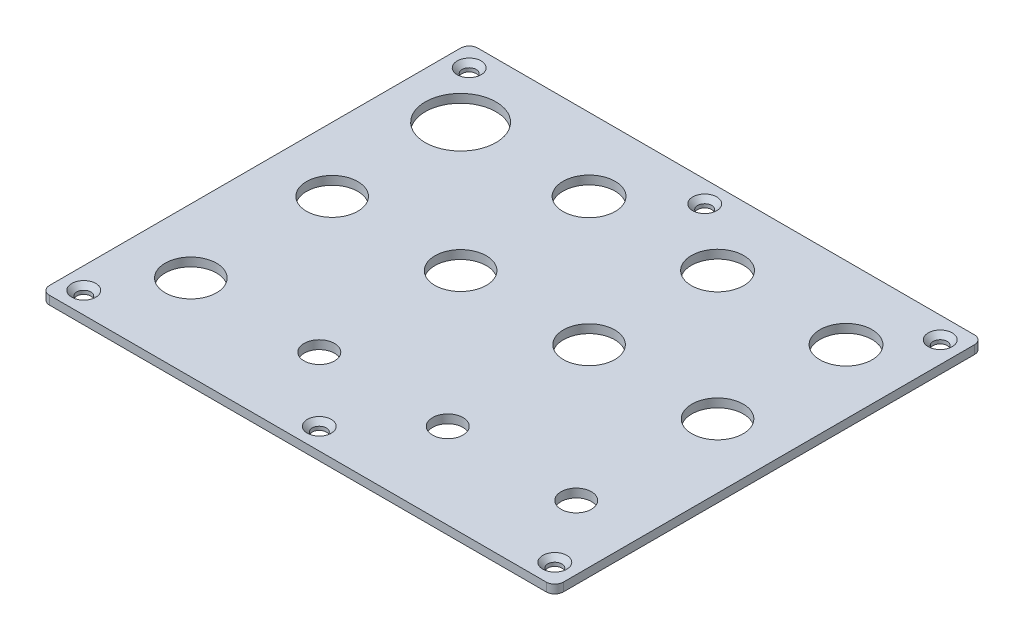
ISO-10303-21;
HEADER;
FILE_DESCRIPTION(('STEP AP214'),'2;1');
FILE_NAME('part.step','',(''),(''),'','','');
FILE_SCHEMA(('AUTOMOTIVE_DESIGN { 1 0 10303 214 1 1 1 1 }'));
ENDSEC;
DATA;
#1=APPLICATION_CONTEXT('core data for automotive mechanical design processes');
#2=APPLICATION_PROTOCOL_DEFINITION('international standard','automotive_design',2000,#1);
#3=PRODUCT_CONTEXT('',#1,'mechanical');
#4=PRODUCT('Part','Part','',(#3));
#5=PRODUCT_RELATED_PRODUCT_CATEGORY('part','',(#4));
#6=PRODUCT_DEFINITION_FORMATION('','',#4);
#7=PRODUCT_DEFINITION_CONTEXT('part definition',#1,'design');
#8=PRODUCT_DEFINITION('design','',#6,#7);
#9=PRODUCT_DEFINITION_SHAPE('','',#8);
#10=(LENGTH_UNIT() NAMED_UNIT(*) SI_UNIT(.MILLI.,.METRE.));
#11=(NAMED_UNIT(*) PLANE_ANGLE_UNIT() SI_UNIT($,.RADIAN.));
#12=(NAMED_UNIT(*) SI_UNIT($,.STERADIAN.) SOLID_ANGLE_UNIT());
#13=UNCERTAINTY_MEASURE_WITH_UNIT(LENGTH_MEASURE(1.E-05),#10,'distance_accuracy_value','');
#14=(GEOMETRIC_REPRESENTATION_CONTEXT(3) GLOBAL_UNCERTAINTY_ASSIGNED_CONTEXT((#13)) GLOBAL_UNIT_ASSIGNED_CONTEXT((#10,
#11,#12)) REPRESENTATION_CONTEXT('',''));
#15=CARTESIAN_POINT('',(0.,0.,0.));
#16=DIRECTION('',(0.,0.,1.));
#17=DIRECTION('',(1.,0.,0.));
#18=AXIS2_PLACEMENT_3D('',#15,#16,#17);
#19=CARTESIAN_POINT('',(-118.,2.,-1.99999999999999));
#20=DIRECTION('',(0.,-1.,0.));
#21=DIRECTION('',(0.,0.,-1.));
#22=AXIS2_PLACEMENT_3D('',#19,#20,#21);
#23=CYLINDRICAL_SURFACE('',#22,2.);
#24=DIRECTION('',(0.,-1.,0.));
#25=VECTOR('',#24,1.);
#26=CARTESIAN_POINT('',(-118.,2.,0.));
#27=LINE('',#26,#25);
#28=CARTESIAN_POINT('',(-118.,2.,0.));
#29=VERTEX_POINT('',#28);
#30=CARTESIAN_POINT('',(-118.,0.,0.));
#31=VERTEX_POINT('',#30);
#32=EDGE_CURVE('E173',#29,#31,#27,.T.);
#33=ORIENTED_EDGE('',*,*,#32,.F.);
#34=CARTESIAN_POINT('',(-118.,2.,-1.99999999999999));
#35=DIRECTION('',(0.,1.,0.));
#36=DIRECTION('',(0.,0.,1.));
#37=AXIS2_PLACEMENT_3D('',#34,#35,#36);
#38=CIRCLE('',#37,2.);
#39=CARTESIAN_POINT('',(-120.,2.,-1.99999999999999));
#40=VERTEX_POINT('',#39);
#41=EDGE_CURVE('E39',#40,#29,#38,.T.);
#42=ORIENTED_EDGE('',*,*,#41,.F.);
#43=DIRECTION('',(0.,-1.,0.));
#44=VECTOR('',#43,1.);
#45=CARTESIAN_POINT('',(-120.,2.,-1.99999999999999));
#46=LINE('',#45,#44);
#47=CARTESIAN_POINT('',(-120.,0.,-1.99999999999999));
#48=VERTEX_POINT('',#47);
#49=EDGE_CURVE('E176',#48,#40,#46,.F.);
#50=ORIENTED_EDGE('',*,*,#49,.F.);
#51=CARTESIAN_POINT('',(-118.,0.,-1.99999999999999));
#52=DIRECTION('',(0.,1.,0.));
#53=DIRECTION('',(0.,0.,1.));
#54=AXIS2_PLACEMENT_3D('',#51,#52,#53);
#55=CIRCLE('',#54,2.);
#56=EDGE_CURVE('E11',#31,#48,#55,.F.);
#57=ORIENTED_EDGE('',*,*,#56,.F.);
#58=EDGE_LOOP('',(#33,#42,#50,#57));
#59=FACE_BOUND('',#58,.T.);
#60=ADVANCED_FACE('F32',(#59),#23,.T.);
#61=CARTESIAN_POINT('',(-2.,2.,-2.));
#62=DIRECTION('',(0.,-1.,0.));
#63=DIRECTION('',(0.,0.,-1.));
#64=AXIS2_PLACEMENT_3D('',#61,#62,#63);
#65=CYLINDRICAL_SURFACE('',#64,2.);
#66=DIRECTION('',(0.,-1.,0.));
#67=VECTOR('',#66,1.);
#68=CARTESIAN_POINT('',(0.,2.,-2.));
#69=LINE('',#68,#67);
#70=CARTESIAN_POINT('',(0.,2.,-2.));
#71=VERTEX_POINT('',#70);
#72=CARTESIAN_POINT('',(0.,0.,-2.));
#73=VERTEX_POINT('',#72);
#74=EDGE_CURVE('E162',#71,#73,#69,.T.);
#75=ORIENTED_EDGE('',*,*,#74,.F.);
#76=CARTESIAN_POINT('',(-2.,2.,-2.));
#77=DIRECTION('',(0.,1.,0.));
#78=DIRECTION('',(0.,0.,1.));
#79=AXIS2_PLACEMENT_3D('',#76,#77,#78);
#80=CIRCLE('',#79,2.);
#81=CARTESIAN_POINT('',(-2.,2.,0.));
#82=VERTEX_POINT('',#81);
#83=EDGE_CURVE('E168',#82,#71,#80,.T.);
#84=ORIENTED_EDGE('',*,*,#83,.F.);
#85=DIRECTION('',(0.,-1.,0.));
#86=VECTOR('',#85,1.);
#87=CARTESIAN_POINT('',(-2.,2.,0.));
#88=LINE('',#87,#86);
#89=CARTESIAN_POINT('',(-2.,0.,0.));
#90=VERTEX_POINT('',#89);
#91=EDGE_CURVE('E165',#90,#82,#88,.F.);
#92=ORIENTED_EDGE('',*,*,#91,.F.);
#93=CARTESIAN_POINT('',(-2.,0.,-2.));
#94=DIRECTION('',(0.,1.,0.));
#95=DIRECTION('',(0.,0.,1.));
#96=AXIS2_PLACEMENT_3D('',#93,#94,#95);
#97=CIRCLE('',#96,2.);
#98=EDGE_CURVE('E170',#73,#90,#97,.F.);
#99=ORIENTED_EDGE('',*,*,#98,.F.);
#100=EDGE_LOOP('',(#75,#84,#92,#99));
#101=FACE_BOUND('',#100,.T.);
#102=ADVANCED_FACE('F215',(#101),#65,.T.);
#103=CARTESIAN_POINT('',(-2.,2.,-98.));
#104=DIRECTION('',(0.,-1.,0.));
#105=DIRECTION('',(0.,0.,-1.));
#106=AXIS2_PLACEMENT_3D('',#103,#104,#105);
#107=CYLINDRICAL_SURFACE('',#106,2.);
#108=DIRECTION('',(0.,-1.,0.));
#109=VECTOR('',#108,1.);
#110=CARTESIAN_POINT('',(-2.,2.,-100.));
#111=LINE('',#110,#109);
#112=CARTESIAN_POINT('',(-2.,2.,-100.));
#113=VERTEX_POINT('',#112);
#114=CARTESIAN_POINT('',(-2.,0.,-100.));
#115=VERTEX_POINT('',#114);
#116=EDGE_CURVE('E104',#113,#115,#111,.T.);
#117=ORIENTED_EDGE('',*,*,#116,.F.);
#118=CARTESIAN_POINT('',(-2.,2.,-98.));
#119=DIRECTION('',(0.,1.,0.));
#120=DIRECTION('',(0.,0.,1.));
#121=AXIS2_PLACEMENT_3D('',#118,#119,#120);
#122=CIRCLE('',#121,2.);
#123=CARTESIAN_POINT('',(0.,2.,-98.));
#124=VERTEX_POINT('',#123);
#125=EDGE_CURVE('E157',#124,#113,#122,.T.);
#126=ORIENTED_EDGE('',*,*,#125,.F.);
#127=DIRECTION('',(0.,-1.,0.));
#128=VECTOR('',#127,1.);
#129=CARTESIAN_POINT('',(0.,2.,-98.));
#130=LINE('',#129,#128);
#131=CARTESIAN_POINT('',(0.,0.,-98.));
#132=VERTEX_POINT('',#131);
#133=EDGE_CURVE('E154',#132,#124,#130,.F.);
#134=ORIENTED_EDGE('',*,*,#133,.F.);
#135=CARTESIAN_POINT('',(-2.,0.,-98.));
#136=DIRECTION('',(0.,1.,0.));
#137=DIRECTION('',(0.,0.,1.));
#138=AXIS2_PLACEMENT_3D('',#135,#136,#137);
#139=CIRCLE('',#138,2.);
#140=EDGE_CURVE('E159',#115,#132,#139,.F.);
#141=ORIENTED_EDGE('',*,*,#140,.F.);
#142=EDGE_LOOP('',(#117,#126,#134,#141));
#143=FACE_BOUND('',#142,.T.);
#144=ADVANCED_FACE('F210',(#143),#107,.T.);
#145=CARTESIAN_POINT('',(-118.,2.,-98.));
#146=DIRECTION('',(0.,-1.,0.));
#147=DIRECTION('',(0.,0.,-1.));
#148=AXIS2_PLACEMENT_3D('',#145,#146,#147);
#149=CYLINDRICAL_SURFACE('',#148,2.);
#150=DIRECTION('',(0.,-1.,0.));
#151=VECTOR('',#150,1.);
#152=CARTESIAN_POINT('',(-120.,2.,-98.));
#153=LINE('',#152,#151);
#154=CARTESIAN_POINT('',(-120.,2.,-98.));
#155=VERTEX_POINT('',#154);
#156=CARTESIAN_POINT('',(-120.,0.,-98.));
#157=VERTEX_POINT('',#156);
#158=EDGE_CURVE('E99',#155,#157,#153,.T.);
#159=ORIENTED_EDGE('',*,*,#158,.F.);
#160=CARTESIAN_POINT('',(-118.,2.,-98.));
#161=DIRECTION('',(0.,1.,0.));
#162=DIRECTION('',(0.,0.,1.));
#163=AXIS2_PLACEMENT_3D('',#160,#161,#162);
#164=CIRCLE('',#163,2.);
#165=CARTESIAN_POINT('',(-118.,2.,-100.));
#166=VERTEX_POINT('',#165);
#167=EDGE_CURVE('E105',#166,#155,#164,.T.);
#168=ORIENTED_EDGE('',*,*,#167,.F.);
#169=DIRECTION('',(0.,-1.,0.));
#170=VECTOR('',#169,1.);
#171=CARTESIAN_POINT('',(-118.,2.,-100.));
#172=LINE('',#171,#170);
#173=CARTESIAN_POINT('',(-118.,0.,-100.));
#174=VERTEX_POINT('',#173);
#175=EDGE_CURVE('E102',#174,#166,#172,.F.);
#176=ORIENTED_EDGE('',*,*,#175,.F.);
#177=CARTESIAN_POINT('',(-118.,0.,-98.));
#178=DIRECTION('',(0.,1.,0.));
#179=DIRECTION('',(0.,0.,1.));
#180=AXIS2_PLACEMENT_3D('',#177,#178,#179);
#181=CIRCLE('',#180,2.);
#182=EDGE_CURVE('E95',#157,#174,#181,.F.);
#183=ORIENTED_EDGE('',*,*,#182,.F.);
#184=EDGE_LOOP('',(#159,#168,#176,#183));
#185=FACE_BOUND('',#184,.T.);
#186=ADVANCED_FACE('F97',(#185),#149,.T.);
#187=CARTESIAN_POINT('',(0.,2.,0.));
#188=DIRECTION('',(-1.,0.,0.));
#189=DIRECTION('',(0.,0.,1.));
#190=AXIS2_PLACEMENT_3D('',#187,#188,#189);
#191=PLANE('',#190);
#192=DIRECTION('',(0.,0.,-1.));
#193=VECTOR('',#192,1.);
#194=CARTESIAN_POINT('',(0.,2.,0.));
#195=LINE('',#194,#193);
#196=EDGE_CURVE('E119',#71,#124,#195,.T.);
#197=ORIENTED_EDGE('',*,*,#196,.F.);
#198=ORIENTED_EDGE('',*,*,#74,.T.);
#199=DIRECTION('',(0.,0.,-1.));
#200=VECTOR('',#199,1.);
#201=CARTESIAN_POINT('',(0.,0.,0.));
#202=LINE('',#201,#200);
#203=EDGE_CURVE('E121',#73,#132,#202,.T.);
#204=ORIENTED_EDGE('',*,*,#203,.T.);
#205=ORIENTED_EDGE('',*,*,#133,.T.);
#206=EDGE_LOOP('',(#197,#198,#204,#205));
#207=FACE_BOUND('',#206,.T.);
#208=ADVANCED_FACE('F212',(#207),#191,.F.);
#209=CARTESIAN_POINT('',(0.,2.,-100.));
#210=DIRECTION('',(0.,0.,1.));
#211=DIRECTION('',(1.,0.,0.));
#212=AXIS2_PLACEMENT_3D('',#209,#210,#211);
#213=PLANE('',#212);
#214=DIRECTION('',(-1.,0.,0.));
#215=VECTOR('',#214,1.);
#216=CARTESIAN_POINT('',(0.,2.,-100.));
#217=LINE('',#216,#215);
#218=EDGE_CURVE('E185',#113,#166,#217,.T.);
#219=ORIENTED_EDGE('',*,*,#218,.F.);
#220=ORIENTED_EDGE('',*,*,#116,.T.);
#221=DIRECTION('',(-1.,0.,0.));
#222=VECTOR('',#221,1.);
#223=CARTESIAN_POINT('',(0.,0.,-100.));
#224=LINE('',#223,#222);
#225=EDGE_CURVE('E117',#115,#174,#224,.T.);
#226=ORIENTED_EDGE('',*,*,#225,.T.);
#227=ORIENTED_EDGE('',*,*,#175,.T.);
#228=EDGE_LOOP('',(#219,#220,#226,#227));
#229=FACE_BOUND('',#228,.T.);
#230=ADVANCED_FACE('F207',(#229),#213,.F.);
#231=CARTESIAN_POINT('',(-120.,2.,0.));
#232=DIRECTION('',(1.,0.,0.));
#233=DIRECTION('',(0.,0.,-1.));
#234=AXIS2_PLACEMENT_3D('',#231,#232,#233);
#235=PLANE('',#234);
#236=DIRECTION('',(0.,0.,1.));
#237=VECTOR('',#236,1.);
#238=CARTESIAN_POINT('',(-120.,0.,0.));
#239=LINE('',#238,#237);
#240=EDGE_CURVE('E110',#157,#48,#239,.T.);
#241=ORIENTED_EDGE('',*,*,#240,.T.);
#242=ORIENTED_EDGE('',*,*,#49,.T.);
#243=DIRECTION('',(0.,0.,1.));
#244=VECTOR('',#243,1.);
#245=CARTESIAN_POINT('',(-120.,2.,0.));
#246=LINE('',#245,#244);
#247=EDGE_CURVE('E112',#155,#40,#246,.T.);
#248=ORIENTED_EDGE('',*,*,#247,.F.);
#249=ORIENTED_EDGE('',*,*,#158,.T.);
#250=EDGE_LOOP('',(#241,#242,#248,#249));
#251=FACE_BOUND('',#250,.T.);
#252=ADVANCED_FACE('F109',(#251),#235,.F.);
#253=CARTESIAN_POINT('',(0.,2.,0.));
#254=DIRECTION('',(0.,0.,-1.));
#255=DIRECTION('',(-1.,0.,0.));
#256=AXIS2_PLACEMENT_3D('',#253,#254,#255);
#257=PLANE('',#256);
#258=DIRECTION('',(1.,0.,0.));
#259=VECTOR('',#258,1.);
#260=CARTESIAN_POINT('',(0.,2.,0.));
#261=LINE('',#260,#259);
#262=EDGE_CURVE('E113',#29,#82,#261,.T.);
#263=ORIENTED_EDGE('',*,*,#262,.F.);
#264=ORIENTED_EDGE('',*,*,#32,.T.);
#265=DIRECTION('',(1.,0.,0.));
#266=VECTOR('',#265,1.);
#267=CARTESIAN_POINT('',(0.,0.,0.));
#268=LINE('',#267,#266);
#269=EDGE_CURVE('E116',#31,#90,#268,.T.);
#270=ORIENTED_EDGE('',*,*,#269,.T.);
#271=ORIENTED_EDGE('',*,*,#91,.T.);
#272=EDGE_LOOP('',(#263,#264,#270,#271));
#273=FACE_BOUND('',#272,.T.);
#274=ADVANCED_FACE('F182',(#273),#257,.F.);
#275=CARTESIAN_POINT('',(0.,2.,0.));
#276=DIRECTION('',(0.,1.,0.));
#277=DIRECTION('',(0.,0.,1.));
#278=AXIS2_PLACEMENT_3D('',#275,#276,#277);
#279=PLANE('',#278);
#280=CARTESIAN_POINT('',(-60.,2.,-5.));
#281=DIRECTION('',(0.,1.,0.));
#282=DIRECTION('',(0.,0.,-1.));
#283=AXIS2_PLACEMENT_3D('',#280,#281,#282);
#284=CIRCLE('',#283,2.8);
#285=CARTESIAN_POINT('',(-60.,2.,-7.8));
#286=VERTEX_POINT('',#285);
#287=EDGE_CURVE('E148',#286,#286,#284,.T.);
#288=ORIENTED_EDGE('',*,*,#287,.F.);
#289=EDGE_LOOP('',(#288));
#290=FACE_BOUND('',#289,.T.);
#291=CARTESIAN_POINT('',(-60.,2.,-95.));
#292=DIRECTION('',(0.,1.,0.));
#293=DIRECTION('',(0.,0.,1.));
#294=AXIS2_PLACEMENT_3D('',#291,#292,#293);
#295=CIRCLE('',#294,2.8);
#296=CARTESIAN_POINT('',(-60.,2.,-92.2));
#297=VERTEX_POINT('',#296);
#298=EDGE_CURVE('E145',#297,#297,#295,.T.);
#299=ORIENTED_EDGE('',*,*,#298,.F.);
#300=EDGE_LOOP('',(#299));
#301=FACE_BOUND('',#300,.T.);
#302=CARTESIAN_POINT('',(-115.,2.,-4.99999999999999));
#303=DIRECTION('',(0.,1.,0.));
#304=DIRECTION('',(0.,0.,1.));
#305=AXIS2_PLACEMENT_3D('',#302,#303,#304);
#306=CIRCLE('',#305,2.79999999999999);
#307=CARTESIAN_POINT('',(-115.,2.,-2.2));
#308=VERTEX_POINT('',#307);
#309=EDGE_CURVE('E141',#308,#308,#306,.T.);
#310=ORIENTED_EDGE('',*,*,#309,.F.);
#311=EDGE_LOOP('',(#310));
#312=FACE_BOUND('',#311,.T.);
#313=CARTESIAN_POINT('',(-5.,2.,-4.99999999999999));
#314=DIRECTION('',(0.,1.,0.));
#315=DIRECTION('',(0.,0.,1.));
#316=AXIS2_PLACEMENT_3D('',#313,#314,#315);
#317=CIRCLE('',#316,2.8);
#318=CARTESIAN_POINT('',(-5.,2.,-2.19999999999999));
#319=VERTEX_POINT('',#318);
#320=EDGE_CURVE('E137',#319,#319,#317,.T.);
#321=ORIENTED_EDGE('',*,*,#320,.F.);
#322=EDGE_LOOP('',(#321));
#323=FACE_BOUND('',#322,.T.);
#324=CARTESIAN_POINT('',(-5.,2.,-95.));
#325=DIRECTION('',(0.,1.,0.));
#326=DIRECTION('',(0.,0.,1.));
#327=AXIS2_PLACEMENT_3D('',#324,#325,#326);
#328=CIRCLE('',#327,2.8);
#329=CARTESIAN_POINT('',(-5.,2.,-92.2));
#330=VERTEX_POINT('',#329);
#331=EDGE_CURVE('E133',#330,#330,#328,.T.);
#332=ORIENTED_EDGE('',*,*,#331,.F.);
#333=EDGE_LOOP('',(#332));
#334=FACE_BOUND('',#333,.T.);
#335=CARTESIAN_POINT('',(-115.,2.,-95.));
#336=DIRECTION('',(0.,1.,0.));
#337=DIRECTION('',(0.,0.,1.));
#338=AXIS2_PLACEMENT_3D('',#335,#336,#337);
#339=CIRCLE('',#338,2.79999999999999);
#340=CARTESIAN_POINT('',(-115.,2.,-92.2));
#341=VERTEX_POINT('',#340);
#342=EDGE_CURVE('E129',#341,#341,#339,.T.);
#343=ORIENTED_EDGE('',*,*,#342,.F.);
#344=EDGE_LOOP('',(#343));
#345=FACE_BOUND('',#344,.T.);
#346=CARTESIAN_POINT('',(-105.,2.,-20.));
#347=DIRECTION('',(0.,1.,0.));
#348=DIRECTION('',(0.,0.,1.));
#349=AXIS2_PLACEMENT_3D('',#346,#347,#348);
#350=CIRCLE('',#349,6.);
#351=CARTESIAN_POINT('',(-105.,2.,-14.));
#352=VERTEX_POINT('',#351);
#353=EDGE_CURVE('E362',#352,#352,#350,.T.);
#354=ORIENTED_EDGE('',*,*,#353,.F.);
#355=EDGE_LOOP('',(#354));
#356=FACE_BOUND('',#355,.T.);
#357=CARTESIAN_POINT('',(-15.,2.,-20.));
#358=DIRECTION('',(0.,1.,0.));
#359=DIRECTION('',(0.,0.,1.));
#360=AXIS2_PLACEMENT_3D('',#357,#358,#359);
#361=CIRCLE('',#360,3.55);
#362=CARTESIAN_POINT('',(-15.,2.,-16.45));
#363=VERTEX_POINT('',#362);
#364=EDGE_CURVE('E366',#363,#363,#361,.T.);
#365=ORIENTED_EDGE('',*,*,#364,.F.);
#366=EDGE_LOOP('',(#365));
#367=FACE_BOUND('',#366,.T.);
#368=CARTESIAN_POINT('',(-45.,2.,-20.));
#369=DIRECTION('',(0.,1.,0.));
#370=DIRECTION('',(0.,0.,1.));
#371=AXIS2_PLACEMENT_3D('',#368,#369,#370);
#372=CIRCLE('',#371,3.55);
#373=CARTESIAN_POINT('',(-45.,2.,-16.45));
#374=VERTEX_POINT('',#373);
#375=EDGE_CURVE('E372',#374,#374,#372,.T.);
#376=ORIENTED_EDGE('',*,*,#375,.F.);
#377=EDGE_LOOP('',(#376));
#378=FACE_BOUND('',#377,.T.);
#379=CARTESIAN_POINT('',(-75.,2.,-20.));
#380=DIRECTION('',(0.,1.,0.));
#381=DIRECTION('',(0.,0.,1.));
#382=AXIS2_PLACEMENT_3D('',#379,#380,#381);
#383=CIRCLE('',#382,3.55);
#384=CARTESIAN_POINT('',(-75.,2.,-16.45));
#385=VERTEX_POINT('',#384);
#386=EDGE_CURVE('E378',#385,#385,#383,.T.);
#387=ORIENTED_EDGE('',*,*,#386,.F.);
#388=EDGE_LOOP('',(#387));
#389=FACE_BOUND('',#388,.T.);
#390=CARTESIAN_POINT('',(-15.,2.,-83.));
#391=DIRECTION('',(0.,1.,0.));
#392=DIRECTION('',(0.,0.,1.));
#393=AXIS2_PLACEMENT_3D('',#390,#391,#392);
#394=CIRCLE('',#393,6.09999999999999);
#395=CARTESIAN_POINT('',(-15.,2.,-76.9));
#396=VERTEX_POINT('',#395);
#397=EDGE_CURVE('E384',#396,#396,#394,.T.);
#398=ORIENTED_EDGE('',*,*,#397,.F.);
#399=EDGE_LOOP('',(#398));
#400=FACE_BOUND('',#399,.T.);
#401=CARTESIAN_POINT('',(-45.,2.,-83.));
#402=DIRECTION('',(0.,1.,0.));
#403=DIRECTION('',(0.,0.,1.));
#404=AXIS2_PLACEMENT_3D('',#401,#402,#403);
#405=CIRCLE('',#404,6.1);
#406=CARTESIAN_POINT('',(-45.,2.,-76.9));
#407=VERTEX_POINT('',#406);
#408=EDGE_CURVE('E390',#407,#407,#405,.T.);
#409=ORIENTED_EDGE('',*,*,#408,.F.);
#410=EDGE_LOOP('',(#409));
#411=FACE_BOUND('',#410,.T.);
#412=CARTESIAN_POINT('',(-75.,2.,-83.));
#413=DIRECTION('',(0.,1.,0.));
#414=DIRECTION('',(0.,0.,1.));
#415=AXIS2_PLACEMENT_3D('',#412,#413,#414);
#416=CIRCLE('',#415,6.09999999999999);
#417=CARTESIAN_POINT('',(-75.,2.,-76.9));
#418=VERTEX_POINT('',#417);
#419=EDGE_CURVE('E396',#418,#418,#416,.T.);
#420=ORIENTED_EDGE('',*,*,#419,.F.);
#421=EDGE_LOOP('',(#420));
#422=FACE_BOUND('',#421,.T.);
#423=CARTESIAN_POINT('',(-105.,2.,-83.));
#424=DIRECTION('',(0.,1.,0.));
#425=DIRECTION('',(0.,0.,1.));
#426=AXIS2_PLACEMENT_3D('',#423,#424,#425);
#427=CIRCLE('',#426,8.25000000000001);
#428=CARTESIAN_POINT('',(-105.,2.,-74.75));
#429=VERTEX_POINT('',#428);
#430=EDGE_CURVE('E402',#429,#429,#427,.T.);
#431=ORIENTED_EDGE('',*,*,#430,.F.);
#432=EDGE_LOOP('',(#431));
#433=FACE_BOUND('',#432,.T.);
#434=CARTESIAN_POINT('',(-15.,2.,-53.));
#435=DIRECTION('',(0.,1.,0.));
#436=DIRECTION('',(0.,0.,1.));
#437=AXIS2_PLACEMENT_3D('',#434,#435,#436);
#438=CIRCLE('',#437,6.00000000000001);
#439=CARTESIAN_POINT('',(-15.,2.,-47.));
#440=VERTEX_POINT('',#439);
#441=EDGE_CURVE('E408',#440,#440,#438,.T.);
#442=ORIENTED_EDGE('',*,*,#441,.F.);
#443=EDGE_LOOP('',(#442));
#444=FACE_BOUND('',#443,.T.);
#445=CARTESIAN_POINT('',(-45.,2.,-53.));
#446=DIRECTION('',(0.,1.,0.));
#447=DIRECTION('',(0.,0.,1.));
#448=AXIS2_PLACEMENT_3D('',#445,#446,#447);
#449=CIRCLE('',#448,6.);
#450=CARTESIAN_POINT('',(-45.,2.,-47.));
#451=VERTEX_POINT('',#450);
#452=EDGE_CURVE('E414',#451,#451,#449,.T.);
#453=ORIENTED_EDGE('',*,*,#452,.F.);
#454=EDGE_LOOP('',(#453));
#455=FACE_BOUND('',#454,.T.);
#456=CARTESIAN_POINT('',(-75.,2.,-53.));
#457=DIRECTION('',(0.,1.,0.));
#458=DIRECTION('',(0.,0.,1.));
#459=AXIS2_PLACEMENT_3D('',#456,#457,#458);
#460=CIRCLE('',#459,6.);
#461=CARTESIAN_POINT('',(-75.,2.,-47.));
#462=VERTEX_POINT('',#461);
#463=EDGE_CURVE('E200',#462,#462,#460,.T.);
#464=ORIENTED_EDGE('',*,*,#463,.F.);
#465=EDGE_LOOP('',(#464));
#466=FACE_BOUND('',#465,.T.);
#467=CARTESIAN_POINT('',(-105.,2.,-53.));
#468=DIRECTION('',(0.,1.,0.));
#469=DIRECTION('',(0.,0.,1.));
#470=AXIS2_PLACEMENT_3D('',#467,#468,#469);
#471=CIRCLE('',#470,6.);
#472=CARTESIAN_POINT('',(-105.,2.,-47.));
#473=VERTEX_POINT('',#472);
#474=EDGE_CURVE('E192',#473,#473,#471,.T.);
#475=ORIENTED_EDGE('',*,*,#474,.F.);
#476=EDGE_LOOP('',(#475));
#477=FACE_BOUND('',#476,.T.);
#478=ORIENTED_EDGE('',*,*,#247,.T.);
#479=ORIENTED_EDGE('',*,*,#41,.T.);
#480=ORIENTED_EDGE('',*,*,#262,.T.);
#481=ORIENTED_EDGE('',*,*,#83,.T.);
#482=ORIENTED_EDGE('',*,*,#196,.T.);
#483=ORIENTED_EDGE('',*,*,#125,.T.);
#484=ORIENTED_EDGE('',*,*,#218,.T.);
#485=ORIENTED_EDGE('',*,*,#167,.T.);
#486=EDGE_LOOP('',(#478,#479,#480,#481,#482,#483,#484,#485));
#487=FACE_BOUND('',#486,.T.);
#488=ADVANCED_FACE('F178',(#290,#301,#312,#323,#334,#345,#356,#367,#378,#389,#400,#411,#422,
#433,#444,#455,#466,#477,#487),#279,.T.);
#489=CARTESIAN_POINT('',(0.,0.,0.));
#490=DIRECTION('',(0.,1.,0.));
#491=DIRECTION('',(0.,0.,1.));
#492=AXIS2_PLACEMENT_3D('',#489,#490,#491);
#493=PLANE('',#492);
#494=CARTESIAN_POINT('',(-60.,0.,-5.));
#495=DIRECTION('',(0.,1.,0.));
#496=DIRECTION('',(0.,0.,-1.));
#497=AXIS2_PLACEMENT_3D('',#494,#495,#496);
#498=CIRCLE('',#497,1.65);
#499=CARTESIAN_POINT('',(-60.,0.,-6.65000000000001));
#500=VERTEX_POINT('',#499);
#501=EDGE_CURVE('E128',#500,#500,#498,.T.);
#502=ORIENTED_EDGE('',*,*,#501,.T.);
#503=EDGE_LOOP('',(#502));
#504=FACE_BOUND('',#503,.T.);
#505=CARTESIAN_POINT('',(-60.,0.,-95.));
#506=DIRECTION('',(0.,1.,0.));
#507=DIRECTION('',(0.,0.,1.));
#508=AXIS2_PLACEMENT_3D('',#505,#506,#507);
#509=CIRCLE('',#508,1.65);
#510=CARTESIAN_POINT('',(-60.,0.,-93.35));
#511=VERTEX_POINT('',#510);
#512=EDGE_CURVE('E343',#511,#511,#509,.T.);
#513=ORIENTED_EDGE('',*,*,#512,.T.);
#514=EDGE_LOOP('',(#513));
#515=FACE_BOUND('',#514,.T.);
#516=CARTESIAN_POINT('',(-115.,0.,-4.99999999999999));
#517=DIRECTION('',(0.,1.,0.));
#518=DIRECTION('',(0.,0.,1.));
#519=AXIS2_PLACEMENT_3D('',#516,#517,#518);
#520=CIRCLE('',#519,1.65);
#521=CARTESIAN_POINT('',(-115.,0.,-3.34999999999999));
#522=VERTEX_POINT('',#521);
#523=EDGE_CURVE('E346',#522,#522,#520,.T.);
#524=ORIENTED_EDGE('',*,*,#523,.T.);
#525=EDGE_LOOP('',(#524));
#526=FACE_BOUND('',#525,.T.);
#527=CARTESIAN_POINT('',(-5.,0.,-4.99999999999999));
#528=DIRECTION('',(0.,1.,0.));
#529=DIRECTION('',(0.,0.,1.));
#530=AXIS2_PLACEMENT_3D('',#527,#528,#529);
#531=CIRCLE('',#530,1.65);
#532=CARTESIAN_POINT('',(-5.,0.,-3.34999999999999));
#533=VERTEX_POINT('',#532);
#534=EDGE_CURVE('E353',#533,#533,#531,.T.);
#535=ORIENTED_EDGE('',*,*,#534,.T.);
#536=EDGE_LOOP('',(#535));
#537=FACE_BOUND('',#536,.T.);
#538=CARTESIAN_POINT('',(-5.,0.,-95.));
#539=DIRECTION('',(0.,1.,0.));
#540=DIRECTION('',(0.,0.,1.));
#541=AXIS2_PLACEMENT_3D('',#538,#539,#540);
#542=CIRCLE('',#541,1.65);
#543=CARTESIAN_POINT('',(-5.,0.,-93.35));
#544=VERTEX_POINT('',#543);
#545=EDGE_CURVE('E356',#544,#544,#542,.T.);
#546=ORIENTED_EDGE('',*,*,#545,.T.);
#547=EDGE_LOOP('',(#546));
#548=FACE_BOUND('',#547,.T.);
#549=CARTESIAN_POINT('',(-115.,0.,-95.));
#550=DIRECTION('',(0.,1.,0.));
#551=DIRECTION('',(0.,0.,1.));
#552=AXIS2_PLACEMENT_3D('',#549,#550,#551);
#553=CIRCLE('',#552,1.65);
#554=CARTESIAN_POINT('',(-115.,0.,-93.35));
#555=VERTEX_POINT('',#554);
#556=EDGE_CURVE('E359',#555,#555,#553,.T.);
#557=ORIENTED_EDGE('',*,*,#556,.T.);
#558=EDGE_LOOP('',(#557));
#559=FACE_BOUND('',#558,.T.);
#560=CARTESIAN_POINT('',(-105.,0.,-20.));
#561=DIRECTION('',(0.,1.,0.));
#562=DIRECTION('',(0.,0.,1.));
#563=AXIS2_PLACEMENT_3D('',#560,#561,#562);
#564=CIRCLE('',#563,6.);
#565=CARTESIAN_POINT('',(-105.,0.,-14.));
#566=VERTEX_POINT('',#565);
#567=EDGE_CURVE('E363',#566,#566,#564,.T.);
#568=ORIENTED_EDGE('',*,*,#567,.T.);
#569=EDGE_LOOP('',(#568));
#570=FACE_BOUND('',#569,.T.);
#571=CARTESIAN_POINT('',(-15.,0.,-20.));
#572=DIRECTION('',(0.,1.,0.));
#573=DIRECTION('',(0.,0.,1.));
#574=AXIS2_PLACEMENT_3D('',#571,#572,#573);
#575=CIRCLE('',#574,3.55);
#576=CARTESIAN_POINT('',(-15.,0.,-16.45));
#577=VERTEX_POINT('',#576);
#578=EDGE_CURVE('E369',#577,#577,#575,.T.);
#579=ORIENTED_EDGE('',*,*,#578,.T.);
#580=EDGE_LOOP('',(#579));
#581=FACE_BOUND('',#580,.T.);
#582=CARTESIAN_POINT('',(-45.,0.,-20.));
#583=DIRECTION('',(0.,1.,0.));
#584=DIRECTION('',(0.,0.,1.));
#585=AXIS2_PLACEMENT_3D('',#582,#583,#584);
#586=CIRCLE('',#585,3.55);
#587=CARTESIAN_POINT('',(-45.,0.,-16.45));
#588=VERTEX_POINT('',#587);
#589=EDGE_CURVE('E375',#588,#588,#586,.T.);
#590=ORIENTED_EDGE('',*,*,#589,.T.);
#591=EDGE_LOOP('',(#590));
#592=FACE_BOUND('',#591,.T.);
#593=CARTESIAN_POINT('',(-75.,0.,-20.));
#594=DIRECTION('',(0.,1.,0.));
#595=DIRECTION('',(0.,0.,1.));
#596=AXIS2_PLACEMENT_3D('',#593,#594,#595);
#597=CIRCLE('',#596,3.55);
#598=CARTESIAN_POINT('',(-75.,0.,-16.45));
#599=VERTEX_POINT('',#598);
#600=EDGE_CURVE('E381',#599,#599,#597,.T.);
#601=ORIENTED_EDGE('',*,*,#600,.T.);
#602=EDGE_LOOP('',(#601));
#603=FACE_BOUND('',#602,.T.);
#604=CARTESIAN_POINT('',(-15.,0.,-83.));
#605=DIRECTION('',(0.,1.,0.));
#606=DIRECTION('',(0.,0.,1.));
#607=AXIS2_PLACEMENT_3D('',#604,#605,#606);
#608=CIRCLE('',#607,6.09999999999999);
#609=CARTESIAN_POINT('',(-15.,0.,-76.9));
#610=VERTEX_POINT('',#609);
#611=EDGE_CURVE('E387',#610,#610,#608,.T.);
#612=ORIENTED_EDGE('',*,*,#611,.T.);
#613=EDGE_LOOP('',(#612));
#614=FACE_BOUND('',#613,.T.);
#615=CARTESIAN_POINT('',(-45.,0.,-83.));
#616=DIRECTION('',(0.,1.,0.));
#617=DIRECTION('',(0.,0.,1.));
#618=AXIS2_PLACEMENT_3D('',#615,#616,#617);
#619=CIRCLE('',#618,6.1);
#620=CARTESIAN_POINT('',(-45.,0.,-76.9));
#621=VERTEX_POINT('',#620);
#622=EDGE_CURVE('E393',#621,#621,#619,.T.);
#623=ORIENTED_EDGE('',*,*,#622,.T.);
#624=EDGE_LOOP('',(#623));
#625=FACE_BOUND('',#624,.T.);
#626=CARTESIAN_POINT('',(-75.,0.,-83.));
#627=DIRECTION('',(0.,1.,0.));
#628=DIRECTION('',(0.,0.,1.));
#629=AXIS2_PLACEMENT_3D('',#626,#627,#628);
#630=CIRCLE('',#629,6.09999999999999);
#631=CARTESIAN_POINT('',(-75.,0.,-76.9));
#632=VERTEX_POINT('',#631);
#633=EDGE_CURVE('E399',#632,#632,#630,.T.);
#634=ORIENTED_EDGE('',*,*,#633,.T.);
#635=EDGE_LOOP('',(#634));
#636=FACE_BOUND('',#635,.T.);
#637=CARTESIAN_POINT('',(-105.,0.,-83.));
#638=DIRECTION('',(0.,1.,0.));
#639=DIRECTION('',(0.,0.,1.));
#640=AXIS2_PLACEMENT_3D('',#637,#638,#639);
#641=CIRCLE('',#640,8.25000000000001);
#642=CARTESIAN_POINT('',(-105.,0.,-74.75));
#643=VERTEX_POINT('',#642);
#644=EDGE_CURVE('E405',#643,#643,#641,.T.);
#645=ORIENTED_EDGE('',*,*,#644,.T.);
#646=EDGE_LOOP('',(#645));
#647=FACE_BOUND('',#646,.T.);
#648=CARTESIAN_POINT('',(-15.,0.,-53.));
#649=DIRECTION('',(0.,1.,0.));
#650=DIRECTION('',(0.,0.,1.));
#651=AXIS2_PLACEMENT_3D('',#648,#649,#650);
#652=CIRCLE('',#651,6.00000000000001);
#653=CARTESIAN_POINT('',(-15.,0.,-47.));
#654=VERTEX_POINT('',#653);
#655=EDGE_CURVE('E411',#654,#654,#652,.T.);
#656=ORIENTED_EDGE('',*,*,#655,.T.);
#657=EDGE_LOOP('',(#656));
#658=FACE_BOUND('',#657,.T.);
#659=CARTESIAN_POINT('',(-45.,0.,-53.));
#660=DIRECTION('',(0.,1.,0.));
#661=DIRECTION('',(0.,0.,1.));
#662=AXIS2_PLACEMENT_3D('',#659,#660,#661);
#663=CIRCLE('',#662,6.);
#664=CARTESIAN_POINT('',(-45.,0.,-47.));
#665=VERTEX_POINT('',#664);
#666=EDGE_CURVE('E417',#665,#665,#663,.T.);
#667=ORIENTED_EDGE('',*,*,#666,.T.);
#668=EDGE_LOOP('',(#667));
#669=FACE_BOUND('',#668,.T.);
#670=CARTESIAN_POINT('',(-75.,0.,-53.));
#671=DIRECTION('',(0.,1.,0.));
#672=DIRECTION('',(0.,0.,1.));
#673=AXIS2_PLACEMENT_3D('',#670,#671,#672);
#674=CIRCLE('',#673,6.);
#675=CARTESIAN_POINT('',(-75.,0.,-47.));
#676=VERTEX_POINT('',#675);
#677=EDGE_CURVE('E197',#676,#676,#674,.T.);
#678=ORIENTED_EDGE('',*,*,#677,.T.);
#679=EDGE_LOOP('',(#678));
#680=FACE_BOUND('',#679,.T.);
#681=CARTESIAN_POINT('',(-105.,0.,-53.));
#682=DIRECTION('',(0.,1.,0.));
#683=DIRECTION('',(0.,0.,1.));
#684=AXIS2_PLACEMENT_3D('',#681,#682,#683);
#685=CIRCLE('',#684,6.);
#686=CARTESIAN_POINT('',(-105.,0.,-47.));
#687=VERTEX_POINT('',#686);
#688=EDGE_CURVE('E188',#687,#687,#685,.T.);
#689=ORIENTED_EDGE('',*,*,#688,.T.);
#690=EDGE_LOOP('',(#689));
#691=FACE_BOUND('',#690,.T.);
#692=ORIENTED_EDGE('',*,*,#269,.F.);
#693=ORIENTED_EDGE('',*,*,#56,.T.);
#694=ORIENTED_EDGE('',*,*,#240,.F.);
#695=ORIENTED_EDGE('',*,*,#182,.T.);
#696=ORIENTED_EDGE('',*,*,#225,.F.);
#697=ORIENTED_EDGE('',*,*,#140,.T.);
#698=ORIENTED_EDGE('',*,*,#203,.F.);
#699=ORIENTED_EDGE('',*,*,#98,.T.);
#700=EDGE_LOOP('',(#692,#693,#694,#695,#696,#697,#698,#699));
#701=FACE_BOUND('',#700,.T.);
#702=ADVANCED_FACE('F115',(#504,#515,#526,#537,#548,#559,#570,#581,#592,#603,#614,#625,#636,
#647,#658,#669,#680,#691,#701),#493,.F.);
#703=CARTESIAN_POINT('',(-105.,0.,-53.));
#704=DIRECTION('',(0.,1.,0.));
#705=DIRECTION('',(0.,0.,1.));
#706=AXIS2_PLACEMENT_3D('',#703,#704,#705);
#707=CYLINDRICAL_SURFACE('',#706,6.);
#708=ORIENTED_EDGE('',*,*,#688,.F.);
#709=EDGE_LOOP('',(#708));
#710=FACE_BOUND('',#709,.T.);
#711=ORIENTED_EDGE('',*,*,#474,.T.);
#712=EDGE_LOOP('',(#711));
#713=FACE_BOUND('',#712,.T.);
#714=ADVANCED_FACE('F235',(#710,#713),#707,.F.);
#715=CARTESIAN_POINT('',(-75.,0.,-53.));
#716=DIRECTION('',(0.,1.,0.));
#717=DIRECTION('',(0.,0.,1.));
#718=AXIS2_PLACEMENT_3D('',#715,#716,#717);
#719=CYLINDRICAL_SURFACE('',#718,6.);
#720=ORIENTED_EDGE('',*,*,#677,.F.);
#721=EDGE_LOOP('',(#720));
#722=FACE_BOUND('',#721,.T.);
#723=ORIENTED_EDGE('',*,*,#463,.T.);
#724=EDGE_LOOP('',(#723));
#725=FACE_BOUND('',#724,.T.);
#726=ADVANCED_FACE('F242',(#722,#725),#719,.F.);
#727=CARTESIAN_POINT('',(-45.,0.,-53.));
#728=DIRECTION('',(0.,1.,0.));
#729=DIRECTION('',(0.,0.,1.));
#730=AXIS2_PLACEMENT_3D('',#727,#728,#729);
#731=CYLINDRICAL_SURFACE('',#730,6.);
#732=ORIENTED_EDGE('',*,*,#666,.F.);
#733=EDGE_LOOP('',(#732));
#734=FACE_BOUND('',#733,.T.);
#735=ORIENTED_EDGE('',*,*,#452,.T.);
#736=EDGE_LOOP('',(#735));
#737=FACE_BOUND('',#736,.T.);
#738=ADVANCED_FACE('F246',(#734,#737),#731,.F.);
#739=CARTESIAN_POINT('',(-15.,0.,-53.));
#740=DIRECTION('',(0.,1.,0.));
#741=DIRECTION('',(0.,0.,1.));
#742=AXIS2_PLACEMENT_3D('',#739,#740,#741);
#743=CYLINDRICAL_SURFACE('',#742,6.00000000000001);
#744=ORIENTED_EDGE('',*,*,#655,.F.);
#745=EDGE_LOOP('',(#744));
#746=FACE_BOUND('',#745,.T.);
#747=ORIENTED_EDGE('',*,*,#441,.T.);
#748=EDGE_LOOP('',(#747));
#749=FACE_BOUND('',#748,.T.);
#750=ADVANCED_FACE('F250',(#746,#749),#743,.F.);
#751=CARTESIAN_POINT('',(-105.,0.,-83.));
#752=DIRECTION('',(0.,1.,0.));
#753=DIRECTION('',(0.,0.,1.));
#754=AXIS2_PLACEMENT_3D('',#751,#752,#753);
#755=CYLINDRICAL_SURFACE('',#754,8.25000000000001);
#756=ORIENTED_EDGE('',*,*,#644,.F.);
#757=EDGE_LOOP('',(#756));
#758=FACE_BOUND('',#757,.T.);
#759=ORIENTED_EDGE('',*,*,#430,.T.);
#760=EDGE_LOOP('',(#759));
#761=FACE_BOUND('',#760,.T.);
#762=ADVANCED_FACE('F254',(#758,#761),#755,.F.);
#763=CARTESIAN_POINT('',(-75.,0.,-83.));
#764=DIRECTION('',(0.,1.,0.));
#765=DIRECTION('',(0.,0.,1.));
#766=AXIS2_PLACEMENT_3D('',#763,#764,#765);
#767=CYLINDRICAL_SURFACE('',#766,6.09999999999999);
#768=ORIENTED_EDGE('',*,*,#633,.F.);
#769=EDGE_LOOP('',(#768));
#770=FACE_BOUND('',#769,.T.);
#771=ORIENTED_EDGE('',*,*,#419,.T.);
#772=EDGE_LOOP('',(#771));
#773=FACE_BOUND('',#772,.T.);
#774=ADVANCED_FACE('F258',(#770,#773),#767,.F.);
#775=CARTESIAN_POINT('',(-45.,0.,-83.));
#776=DIRECTION('',(0.,1.,0.));
#777=DIRECTION('',(0.,0.,1.));
#778=AXIS2_PLACEMENT_3D('',#775,#776,#777);
#779=CYLINDRICAL_SURFACE('',#778,6.1);
#780=ORIENTED_EDGE('',*,*,#622,.F.);
#781=EDGE_LOOP('',(#780));
#782=FACE_BOUND('',#781,.T.);
#783=ORIENTED_EDGE('',*,*,#408,.T.);
#784=EDGE_LOOP('',(#783));
#785=FACE_BOUND('',#784,.T.);
#786=ADVANCED_FACE('F262',(#782,#785),#779,.F.);
#787=CARTESIAN_POINT('',(-15.,0.,-83.));
#788=DIRECTION('',(0.,1.,0.));
#789=DIRECTION('',(0.,0.,1.));
#790=AXIS2_PLACEMENT_3D('',#787,#788,#789);
#791=CYLINDRICAL_SURFACE('',#790,6.09999999999999);
#792=ORIENTED_EDGE('',*,*,#611,.F.);
#793=EDGE_LOOP('',(#792));
#794=FACE_BOUND('',#793,.T.);
#795=ORIENTED_EDGE('',*,*,#397,.T.);
#796=EDGE_LOOP('',(#795));
#797=FACE_BOUND('',#796,.T.);
#798=ADVANCED_FACE('F266',(#794,#797),#791,.F.);
#799=CARTESIAN_POINT('',(-75.,0.,-20.));
#800=DIRECTION('',(0.,1.,0.));
#801=DIRECTION('',(0.,0.,1.));
#802=AXIS2_PLACEMENT_3D('',#799,#800,#801);
#803=CYLINDRICAL_SURFACE('',#802,3.55);
#804=ORIENTED_EDGE('',*,*,#600,.F.);
#805=EDGE_LOOP('',(#804));
#806=FACE_BOUND('',#805,.T.);
#807=ORIENTED_EDGE('',*,*,#386,.T.);
#808=EDGE_LOOP('',(#807));
#809=FACE_BOUND('',#808,.T.);
#810=ADVANCED_FACE('F270',(#806,#809),#803,.F.);
#811=CARTESIAN_POINT('',(-45.,0.,-20.));
#812=DIRECTION('',(0.,1.,0.));
#813=DIRECTION('',(0.,0.,1.));
#814=AXIS2_PLACEMENT_3D('',#811,#812,#813);
#815=CYLINDRICAL_SURFACE('',#814,3.55);
#816=ORIENTED_EDGE('',*,*,#589,.F.);
#817=EDGE_LOOP('',(#816));
#818=FACE_BOUND('',#817,.T.);
#819=ORIENTED_EDGE('',*,*,#375,.T.);
#820=EDGE_LOOP('',(#819));
#821=FACE_BOUND('',#820,.T.);
#822=ADVANCED_FACE('F274',(#818,#821),#815,.F.);
#823=CARTESIAN_POINT('',(-15.,0.,-20.));
#824=DIRECTION('',(0.,1.,0.));
#825=DIRECTION('',(0.,0.,1.));
#826=AXIS2_PLACEMENT_3D('',#823,#824,#825);
#827=CYLINDRICAL_SURFACE('',#826,3.55);
#828=ORIENTED_EDGE('',*,*,#578,.F.);
#829=EDGE_LOOP('',(#828));
#830=FACE_BOUND('',#829,.T.);
#831=ORIENTED_EDGE('',*,*,#364,.T.);
#832=EDGE_LOOP('',(#831));
#833=FACE_BOUND('',#832,.T.);
#834=ADVANCED_FACE('F278',(#830,#833),#827,.F.);
#835=CARTESIAN_POINT('',(-105.,0.,-20.));
#836=DIRECTION('',(0.,1.,0.));
#837=DIRECTION('',(0.,0.,1.));
#838=AXIS2_PLACEMENT_3D('',#835,#836,#837);
#839=CYLINDRICAL_SURFACE('',#838,6.);
#840=ORIENTED_EDGE('',*,*,#567,.F.);
#841=EDGE_LOOP('',(#840));
#842=FACE_BOUND('',#841,.T.);
#843=ORIENTED_EDGE('',*,*,#353,.T.);
#844=EDGE_LOOP('',(#843));
#845=FACE_BOUND('',#844,.T.);
#846=ADVANCED_FACE('F282',(#842,#845),#839,.F.);
#847=CARTESIAN_POINT('',(-115.,0.,-95.));
#848=DIRECTION('',(0.,1.,0.));
#849=DIRECTION('',(0.,0.,1.));
#850=AXIS2_PLACEMENT_3D('',#847,#848,#849);
#851=CYLINDRICAL_SURFACE('',#850,1.65);
#852=CARTESIAN_POINT('',(-115.,0.850000000000015,-95.));
#853=DIRECTION('',(0.,1.,0.));
#854=DIRECTION('',(0.,0.,1.));
#855=AXIS2_PLACEMENT_3D('',#852,#853,#854);
#856=CIRCLE('',#855,1.65);
#857=CARTESIAN_POINT('',(-115.,0.850000000000015,-93.35));
#858=VERTEX_POINT('',#857);
#859=EDGE_CURVE('E125',#858,#858,#856,.T.);
#860=ORIENTED_EDGE('',*,*,#859,.T.);
#861=EDGE_LOOP('',(#860));
#862=FACE_BOUND('',#861,.T.);
#863=ORIENTED_EDGE('',*,*,#556,.F.);
#864=EDGE_LOOP('',(#863));
#865=FACE_BOUND('',#864,.T.);
#866=ADVANCED_FACE('F286',(#862,#865),#851,.F.);
#867=CARTESIAN_POINT('',(-5.,0.,-95.));
#868=DIRECTION('',(0.,1.,0.));
#869=DIRECTION('',(0.,0.,1.));
#870=AXIS2_PLACEMENT_3D('',#867,#868,#869);
#871=CYLINDRICAL_SURFACE('',#870,1.65);
#872=CARTESIAN_POINT('',(-5.,0.850000000000008,-95.));
#873=DIRECTION('',(0.,1.,0.));
#874=DIRECTION('',(0.,0.,1.));
#875=AXIS2_PLACEMENT_3D('',#872,#873,#874);
#876=CIRCLE('',#875,1.65);
#877=CARTESIAN_POINT('',(-5.,0.850000000000008,-93.35));
#878=VERTEX_POINT('',#877);
#879=EDGE_CURVE('E130',#878,#878,#876,.T.);
#880=ORIENTED_EDGE('',*,*,#879,.T.);
#881=EDGE_LOOP('',(#880));
#882=FACE_BOUND('',#881,.T.);
#883=ORIENTED_EDGE('',*,*,#545,.F.);
#884=EDGE_LOOP('',(#883));
#885=FACE_BOUND('',#884,.T.);
#886=ADVANCED_FACE('F290',(#882,#885),#871,.F.);
#887=CARTESIAN_POINT('',(-5.,0.,-4.99999999999999));
#888=DIRECTION('',(0.,1.,0.));
#889=DIRECTION('',(0.,0.,1.));
#890=AXIS2_PLACEMENT_3D('',#887,#888,#889);
#891=CYLINDRICAL_SURFACE('',#890,1.65);
#892=CARTESIAN_POINT('',(-5.,0.850000000000004,-4.99999999999999));
#893=DIRECTION('',(0.,1.,0.));
#894=DIRECTION('',(0.,0.,1.));
#895=AXIS2_PLACEMENT_3D('',#892,#893,#894);
#896=CIRCLE('',#895,1.65);
#897=CARTESIAN_POINT('',(-5.,0.850000000000004,-3.34999999999999));
#898=VERTEX_POINT('',#897);
#899=EDGE_CURVE('E134',#898,#898,#896,.T.);
#900=ORIENTED_EDGE('',*,*,#899,.T.);
#901=EDGE_LOOP('',(#900));
#902=FACE_BOUND('',#901,.T.);
#903=ORIENTED_EDGE('',*,*,#534,.F.);
#904=EDGE_LOOP('',(#903));
#905=FACE_BOUND('',#904,.T.);
#906=ADVANCED_FACE('F294',(#902,#905),#891,.F.);
#907=CARTESIAN_POINT('',(-115.,0.,-4.99999999999999));
#908=DIRECTION('',(0.,1.,0.));
#909=DIRECTION('',(0.,0.,1.));
#910=AXIS2_PLACEMENT_3D('',#907,#908,#909);
#911=CYLINDRICAL_SURFACE('',#910,1.65);
#912=CARTESIAN_POINT('',(-115.,0.850000000000014,-4.99999999999999));
#913=DIRECTION('',(0.,1.,0.));
#914=DIRECTION('',(0.,0.,1.));
#915=AXIS2_PLACEMENT_3D('',#912,#913,#914);
#916=CIRCLE('',#915,1.65);
#917=CARTESIAN_POINT('',(-115.,0.850000000000014,-3.34999999999999));
#918=VERTEX_POINT('',#917);
#919=EDGE_CURVE('E138',#918,#918,#916,.T.);
#920=ORIENTED_EDGE('',*,*,#919,.T.);
#921=EDGE_LOOP('',(#920));
#922=FACE_BOUND('',#921,.T.);
#923=ORIENTED_EDGE('',*,*,#523,.F.);
#924=EDGE_LOOP('',(#923));
#925=FACE_BOUND('',#924,.T.);
#926=ADVANCED_FACE('F298',(#922,#925),#911,.F.);
#927=CARTESIAN_POINT('',(-60.,0.,-95.));
#928=DIRECTION('',(0.,1.,0.));
#929=DIRECTION('',(0.,0.,1.));
#930=AXIS2_PLACEMENT_3D('',#927,#928,#929);
#931=CYLINDRICAL_SURFACE('',#930,1.65);
#932=CARTESIAN_POINT('',(-60.,0.850000000000008,-95.));
#933=DIRECTION('',(0.,1.,0.));
#934=DIRECTION('',(0.,0.,1.));
#935=AXIS2_PLACEMENT_3D('',#932,#933,#934);
#936=CIRCLE('',#935,1.65);
#937=CARTESIAN_POINT('',(-60.,0.850000000000008,-93.35));
#938=VERTEX_POINT('',#937);
#939=EDGE_CURVE('E142',#938,#938,#936,.T.);
#940=ORIENTED_EDGE('',*,*,#939,.T.);
#941=EDGE_LOOP('',(#940));
#942=FACE_BOUND('',#941,.T.);
#943=ORIENTED_EDGE('',*,*,#512,.F.);
#944=EDGE_LOOP('',(#943));
#945=FACE_BOUND('',#944,.T.);
#946=ADVANCED_FACE('F302',(#942,#945),#931,.F.);
#947=CARTESIAN_POINT('',(-60.,0.,-5.));
#948=DIRECTION('',(0.,1.,0.));
#949=DIRECTION('',(0.,0.,1.));
#950=AXIS2_PLACEMENT_3D('',#947,#948,#949);
#951=CYLINDRICAL_SURFACE('',#950,1.65);
#952=CARTESIAN_POINT('',(-60.,0.850000000000008,-5.));
#953=DIRECTION('',(0.,1.,0.));
#954=DIRECTION('',(0.,0.,1.));
#955=AXIS2_PLACEMENT_3D('',#952,#953,#954);
#956=CIRCLE('',#955,1.65);
#957=CARTESIAN_POINT('',(-60.,0.850000000000008,-3.35));
#958=VERTEX_POINT('',#957);
#959=EDGE_CURVE('E146',#958,#958,#956,.T.);
#960=ORIENTED_EDGE('',*,*,#959,.T.);
#961=EDGE_LOOP('',(#960));
#962=FACE_BOUND('',#961,.T.);
#963=ORIENTED_EDGE('',*,*,#501,.F.);
#964=EDGE_LOOP('',(#963));
#965=FACE_BOUND('',#964,.T.);
#966=ADVANCED_FACE('F306',(#962,#965),#951,.F.);
#967=CARTESIAN_POINT('',(-115.,2.,-95.));
#968=DIRECTION('',(0.,1.,0.));
#969=DIRECTION('',(0.,0.,1.));
#970=AXIS2_PLACEMENT_3D('',#967,#968,#969);
#971=CONICAL_SURFACE('',#970,2.79999999999999,0.78539816339745);
#972=ORIENTED_EDGE('',*,*,#342,.T.);
#973=EDGE_LOOP('',(#972));
#974=FACE_BOUND('',#973,.T.);
#975=ORIENTED_EDGE('',*,*,#859,.F.);
#976=EDGE_LOOP('',(#975));
#977=FACE_BOUND('',#976,.T.);
#978=ADVANCED_FACE('F310',(#974,#977),#971,.F.);
#979=CARTESIAN_POINT('',(-5.,2.,-95.));
#980=DIRECTION('',(0.,1.,0.));
#981=DIRECTION('',(0.,0.,1.));
#982=AXIS2_PLACEMENT_3D('',#979,#980,#981);
#983=CONICAL_SURFACE('',#982,2.8,0.78539816339745);
#984=ORIENTED_EDGE('',*,*,#331,.T.);
#985=EDGE_LOOP('',(#984));
#986=FACE_BOUND('',#985,.T.);
#987=ORIENTED_EDGE('',*,*,#879,.F.);
#988=EDGE_LOOP('',(#987));
#989=FACE_BOUND('',#988,.T.);
#990=ADVANCED_FACE('F314',(#986,#989),#983,.F.);
#991=CARTESIAN_POINT('',(-5.,2.,-4.99999999999999));
#992=DIRECTION('',(0.,1.,0.));
#993=DIRECTION('',(0.,0.,1.));
#994=AXIS2_PLACEMENT_3D('',#991,#992,#993);
#995=CONICAL_SURFACE('',#994,2.8,0.78539816339745);
#996=ORIENTED_EDGE('',*,*,#320,.T.);
#997=EDGE_LOOP('',(#996));
#998=FACE_BOUND('',#997,.T.);
#999=ORIENTED_EDGE('',*,*,#899,.F.);
#1000=EDGE_LOOP('',(#999));
#1001=FACE_BOUND('',#1000,.T.);
#1002=ADVANCED_FACE('F318',(#998,#1001),#995,.F.);
#1003=CARTESIAN_POINT('',(-115.,2.,-4.99999999999999));
#1004=DIRECTION('',(0.,1.,0.));
#1005=DIRECTION('',(0.,0.,1.));
#1006=AXIS2_PLACEMENT_3D('',#1003,#1004,#1005);
#1007=CONICAL_SURFACE('',#1006,2.79999999999999,0.78539816339745);
#1008=ORIENTED_EDGE('',*,*,#309,.T.);
#1009=EDGE_LOOP('',(#1008));
#1010=FACE_BOUND('',#1009,.T.);
#1011=ORIENTED_EDGE('',*,*,#919,.F.);
#1012=EDGE_LOOP('',(#1011));
#1013=FACE_BOUND('',#1012,.T.);
#1014=ADVANCED_FACE('F322',(#1010,#1013),#1007,.F.);
#1015=CARTESIAN_POINT('',(-60.,2.,-95.));
#1016=DIRECTION('',(0.,1.,0.));
#1017=DIRECTION('',(0.,0.,1.));
#1018=AXIS2_PLACEMENT_3D('',#1015,#1016,#1017);
#1019=CONICAL_SURFACE('',#1018,2.8,0.78539816339745);
#1020=ORIENTED_EDGE('',*,*,#298,.T.);
#1021=EDGE_LOOP('',(#1020));
#1022=FACE_BOUND('',#1021,.T.);
#1023=ORIENTED_EDGE('',*,*,#939,.F.);
#1024=EDGE_LOOP('',(#1023));
#1025=FACE_BOUND('',#1024,.T.);
#1026=ADVANCED_FACE('F326',(#1022,#1025),#1019,.F.);
#1027=CARTESIAN_POINT('',(-60.,2.,-5.));
#1028=DIRECTION('',(0.,1.,0.));
#1029=DIRECTION('',(0.,0.,-1.));
#1030=AXIS2_PLACEMENT_3D('',#1027,#1028,#1029);
#1031=CONICAL_SURFACE('',#1030,2.8,0.78539816339745);
#1032=ORIENTED_EDGE('',*,*,#287,.T.);
#1033=EDGE_LOOP('',(#1032));
#1034=FACE_BOUND('',#1033,.T.);
#1035=ORIENTED_EDGE('',*,*,#959,.F.);
#1036=EDGE_LOOP('',(#1035));
#1037=FACE_BOUND('',#1036,.T.);
#1038=ADVANCED_FACE('F330',(#1034,#1037),#1031,.F.);
#1039=CLOSED_SHELL('',(#60,#102,#144,#186,#208,#230,#252,#274,#488,#702,#714,#726,#738,#750,
#762,#774,#786,#798,#810,#822,#834,#846,#866,#886,#906,#926,#946,#966,#978,#990,#1002,#1014,
#1026,#1038));
#1040=MANIFOLD_SOLID_BREP('B2',#1039);
#1041=ADVANCED_BREP_SHAPE_REPRESENTATION('',(#18,#1040),#14);
#1042=SHAPE_DEFINITION_REPRESENTATION(#9,#1041);
ENDSEC;
END-ISO-10303-21;
